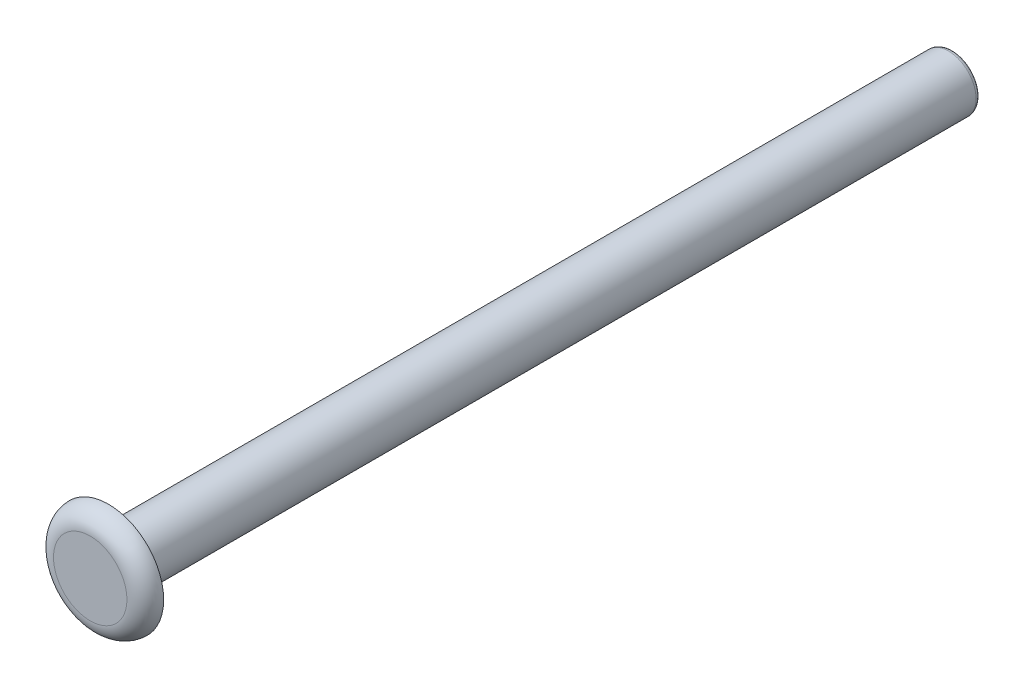
ISO-10303-21;
HEADER;
FILE_DESCRIPTION(('STEP AP214'),'2;1');
FILE_NAME('part.step','',(''),(''),'','','');
FILE_SCHEMA(('AUTOMOTIVE_DESIGN { 1 0 10303 214 1 1 1 1 }'));
ENDSEC;
DATA;
#1=APPLICATION_CONTEXT('core data for automotive mechanical design processes');
#2=APPLICATION_PROTOCOL_DEFINITION('international standard','automotive_design',2000,#1);
#3=PRODUCT_CONTEXT('',#1,'mechanical');
#4=PRODUCT('Part','Part','',(#3));
#5=PRODUCT_RELATED_PRODUCT_CATEGORY('part','',(#4));
#6=PRODUCT_DEFINITION_FORMATION('','',#4);
#7=PRODUCT_DEFINITION_CONTEXT('part definition',#1,'design');
#8=PRODUCT_DEFINITION('design','',#6,#7);
#9=PRODUCT_DEFINITION_SHAPE('','',#8);
#10=(LENGTH_UNIT() NAMED_UNIT(*) SI_UNIT(.MILLI.,.METRE.));
#11=(NAMED_UNIT(*) PLANE_ANGLE_UNIT() SI_UNIT($,.RADIAN.));
#12=(NAMED_UNIT(*) SI_UNIT($,.STERADIAN.) SOLID_ANGLE_UNIT());
#13=UNCERTAINTY_MEASURE_WITH_UNIT(LENGTH_MEASURE(1.E-05),#10,'distance_accuracy_value','');
#14=(GEOMETRIC_REPRESENTATION_CONTEXT(3) GLOBAL_UNCERTAINTY_ASSIGNED_CONTEXT((#13)) GLOBAL_UNIT_ASSIGNED_CONTEXT((#10,
#11,#12)) REPRESENTATION_CONTEXT('',''));
#15=CARTESIAN_POINT('',(0.,0.,0.));
#16=DIRECTION('',(0.,0.,1.));
#17=DIRECTION('',(1.,0.,0.));
#18=AXIS2_PLACEMENT_3D('',#15,#16,#17);
#19=CARTESIAN_POINT('',(-28.0682567910714,21.8847009830465,46.));
#20=DIRECTION('',(0.,0.,-1.));
#21=DIRECTION('',(-1.,0.,0.));
#22=AXIS2_PLACEMENT_3D('',#19,#20,#21);
#23=CYLINDRICAL_SURFACE('',#22,1.5);
#24=CARTESIAN_POINT('',(-28.0682567910714,21.8847009830465,0.25));
#25=DIRECTION('',(0.,0.,1.));
#26=DIRECTION('',(1.,0.,0.));
#27=AXIS2_PLACEMENT_3D('',#24,#25,#26);
#28=CIRCLE('',#27,1.5);
#29=CARTESIAN_POINT('',(-26.5682567910714,21.8847009830465,0.25));
#30=VERTEX_POINT('',#29);
#31=EDGE_CURVE('E42',#30,#30,#28,.T.);
#32=ORIENTED_EDGE('',*,*,#31,.T.);
#33=EDGE_LOOP('',(#32));
#34=FACE_BOUND('',#33,.T.);
#35=CARTESIAN_POINT('',(-28.0682567910714,21.8847009830465,46.));
#36=DIRECTION('',(0.,0.,1.));
#37=DIRECTION('',(1.,0.,0.));
#38=AXIS2_PLACEMENT_3D('',#35,#36,#37);
#39=CIRCLE('',#38,1.5);
#40=CARTESIAN_POINT('',(-26.5682567910714,21.8847009830465,46.));
#41=VERTEX_POINT('',#40);
#42=EDGE_CURVE('E50',#41,#41,#39,.T.);
#43=ORIENTED_EDGE('',*,*,#42,.F.);
#44=EDGE_LOOP('',(#43));
#45=FACE_BOUND('',#44,.T.);
#46=ADVANCED_FACE('F35',(#34,#45),#23,.T.);
#47=CARTESIAN_POINT('',(-28.0682567910714,21.8847009830465,0.));
#48=DIRECTION('',(0.,0.,1.));
#49=DIRECTION('',(1.,0.,0.));
#50=AXIS2_PLACEMENT_3D('',#47,#48,#49);
#51=PLANE('',#50);
#52=CARTESIAN_POINT('',(-28.0682567910714,21.8847009830465,0.));
#53=DIRECTION('',(0.,0.,1.));
#54=DIRECTION('',(1.,0.,0.));
#55=AXIS2_PLACEMENT_3D('',#52,#53,#54);
#56=CIRCLE('',#55,1.25);
#57=CARTESIAN_POINT('',(-26.8182567910714,21.8847009830465,0.));
#58=VERTEX_POINT('',#57);
#59=EDGE_CURVE('E10',#58,#58,#56,.F.);
#60=ORIENTED_EDGE('',*,*,#59,.T.);
#61=EDGE_LOOP('',(#60));
#62=FACE_BOUND('',#61,.T.);
#63=ADVANCED_FACE('F71',(#62),#51,.F.);
#64=CARTESIAN_POINT('',(-28.0682567910714,21.8847009830465,47.));
#65=DIRECTION('',(0.,0.,1.));
#66=DIRECTION('',(1.,0.,0.));
#67=AXIS2_PLACEMENT_3D('',#64,#65,#66);
#68=PLANE('',#67);
#69=CARTESIAN_POINT('',(-28.0682567910714,21.8847009830465,47.));
#70=DIRECTION('',(0.,0.,1.));
#71=DIRECTION('',(1.,0.,0.));
#72=AXIS2_PLACEMENT_3D('',#69,#70,#71);
#73=CIRCLE('',#72,2.);
#74=CARTESIAN_POINT('',(-26.0682567910714,21.8847009830465,47.));
#75=VERTEX_POINT('',#74);
#76=EDGE_CURVE('E46',#75,#75,#73,.T.);
#77=ORIENTED_EDGE('',*,*,#76,.T.);
#78=EDGE_LOOP('',(#77));
#79=FACE_BOUND('',#78,.T.);
#80=ADVANCED_FACE('F64',(#79),#68,.T.);
#81=CARTESIAN_POINT('',(-28.0682567910714,21.8847009830465,46.));
#82=DIRECTION('',(0.,0.,1.));
#83=DIRECTION('',(1.,0.,0.));
#84=AXIS2_PLACEMENT_3D('',#81,#82,#83);
#85=PLANE('',#84);
#86=ORIENTED_EDGE('',*,*,#42,.T.);
#87=EDGE_LOOP('',(#86));
#88=FACE_BOUND('',#87,.T.);
#89=CARTESIAN_POINT('',(-28.0682567910714,21.8847009830465,46.));
#90=DIRECTION('',(0.,0.,1.));
#91=DIRECTION('',(1.,0.,0.));
#92=AXIS2_PLACEMENT_3D('',#89,#90,#91);
#93=CIRCLE('',#92,3.);
#94=CARTESIAN_POINT('',(-25.0682567910714,21.8847009830465,46.));
#95=VERTEX_POINT('',#94);
#96=EDGE_CURVE('E55',#95,#95,#93,.T.);
#97=ORIENTED_EDGE('',*,*,#96,.F.);
#98=EDGE_LOOP('',(#97));
#99=FACE_BOUND('',#98,.T.);
#100=ADVANCED_FACE('F62',(#88,#99),#85,.F.);
#101=CARTESIAN_POINT('',(-28.0682567910714,21.8847009830465,46.));
#102=DIRECTION('',(0.,0.,1.));
#103=DIRECTION('',(1.,0.,0.));
#104=AXIS2_PLACEMENT_3D('',#101,#102,#103);
#105=TOROIDAL_SURFACE('',#104,2.,1.);
#106=ORIENTED_EDGE('',*,*,#96,.T.);
#107=EDGE_LOOP('',(#106));
#108=FACE_BOUND('',#107,.T.);
#109=ORIENTED_EDGE('',*,*,#76,.F.);
#110=EDGE_LOOP('',(#109));
#111=FACE_BOUND('',#110,.T.);
#112=ADVANCED_FACE('F59',(#108,#111),#105,.T.);
#113=CARTESIAN_POINT('',(-28.0682567910714,21.8847009830465,0.25));
#114=DIRECTION('',(0.,0.,1.));
#115=DIRECTION('',(1.,0.,0.));
#116=AXIS2_PLACEMENT_3D('',#113,#114,#115);
#117=TOROIDAL_SURFACE('',#116,1.25,0.25);
#118=ORIENTED_EDGE('',*,*,#59,.F.);
#119=EDGE_LOOP('',(#118));
#120=FACE_BOUND('',#119,.T.);
#121=ORIENTED_EDGE('',*,*,#31,.F.);
#122=EDGE_LOOP('',(#121));
#123=FACE_BOUND('',#122,.T.);
#124=ADVANCED_FACE('F37',(#120,#123),#117,.T.);
#125=CLOSED_SHELL('',(#46,#63,#80,#100,#112,#124));
#126=MANIFOLD_SOLID_BREP('B2',#125);
#127=ADVANCED_BREP_SHAPE_REPRESENTATION('',(#18,#126),#14);
#128=SHAPE_DEFINITION_REPRESENTATION(#9,#127);
ENDSEC;
END-ISO-10303-21;
